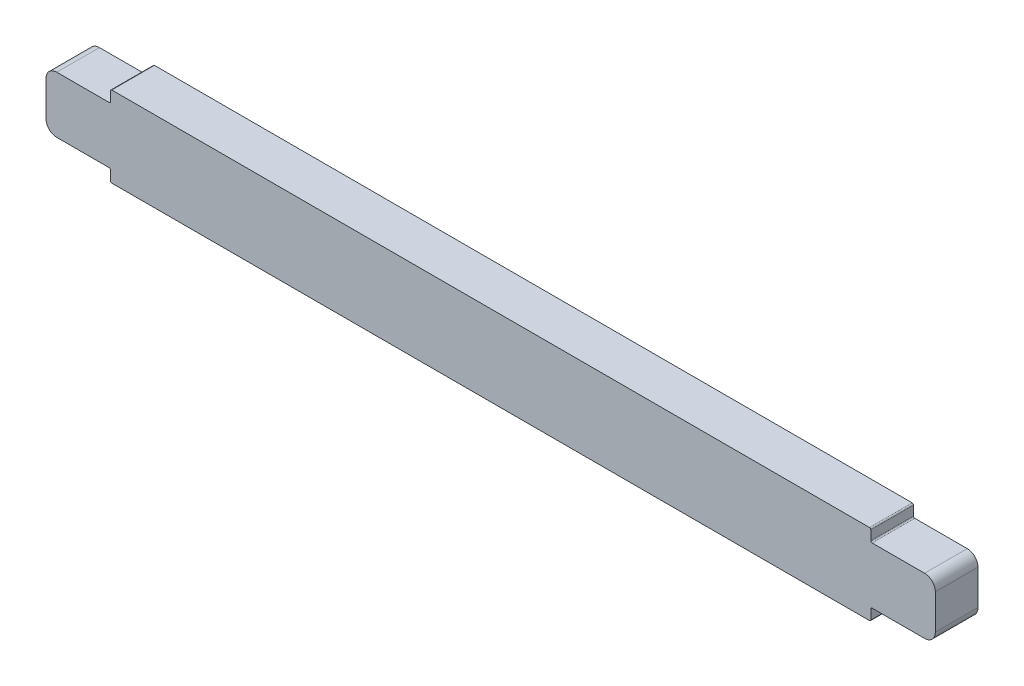
ISO-10303-21;
HEADER;
FILE_DESCRIPTION(('STEP AP214'),'2;1');
FILE_NAME('part.step','',(''),(''),'','','');
FILE_SCHEMA(('AUTOMOTIVE_DESIGN { 1 0 10303 214 1 1 1 1 }'));
ENDSEC;
DATA;
#1=APPLICATION_CONTEXT('core data for automotive mechanical design processes');
#2=APPLICATION_PROTOCOL_DEFINITION('international standard','automotive_design',2000,#1);
#3=PRODUCT_CONTEXT('',#1,'mechanical');
#4=PRODUCT('Part','Part','',(#3));
#5=PRODUCT_RELATED_PRODUCT_CATEGORY('part','',(#4));
#6=PRODUCT_DEFINITION_FORMATION('','',#4);
#7=PRODUCT_DEFINITION_CONTEXT('part definition',#1,'design');
#8=PRODUCT_DEFINITION('design','',#6,#7);
#9=PRODUCT_DEFINITION_SHAPE('','',#8);
#10=(LENGTH_UNIT() NAMED_UNIT(*) SI_UNIT(.MILLI.,.METRE.));
#11=(NAMED_UNIT(*) PLANE_ANGLE_UNIT() SI_UNIT($,.RADIAN.));
#12=(NAMED_UNIT(*) SI_UNIT($,.STERADIAN.) SOLID_ANGLE_UNIT());
#13=UNCERTAINTY_MEASURE_WITH_UNIT(LENGTH_MEASURE(1.E-05),#10,'distance_accuracy_value','');
#14=(GEOMETRIC_REPRESENTATION_CONTEXT(3) GLOBAL_UNCERTAINTY_ASSIGNED_CONTEXT((#13)) GLOBAL_UNIT_ASSIGNED_CONTEXT((#10,
#11,#12)) REPRESENTATION_CONTEXT('',''));
#15=CARTESIAN_POINT('',(0.,0.,0.));
#16=DIRECTION('',(0.,0.,1.));
#17=DIRECTION('',(1.,0.,0.));
#18=AXIS2_PLACEMENT_3D('',#15,#16,#17);
#19=CARTESIAN_POINT('',(33.08,-3.,3.175));
#20=DIRECTION('',(-1.,0.,0.));
#21=DIRECTION('',(0.,0.,1.));
#22=AXIS2_PLACEMENT_3D('',#19,#20,#21);
#23=PLANE('',#22);
#24=DIRECTION('',(0.,1.,0.));
#25=VECTOR('',#24,1.);
#26=CARTESIAN_POINT('',(33.08,-3.,0.));
#27=LINE('',#26,#25);
#28=CARTESIAN_POINT('',(33.08,-1.3,0.));
#29=VERTEX_POINT('',#28);
#30=CARTESIAN_POINT('',(33.08,1.3,0.));
#31=VERTEX_POINT('',#30);
#32=EDGE_CURVE('E362',#29,#31,#27,.T.);
#33=ORIENTED_EDGE('',*,*,#32,.T.);
#34=DIRECTION('',(0.,0.,1.));
#35=VECTOR('',#34,1.);
#36=CARTESIAN_POINT('',(33.08,1.3,3.175));
#37=LINE('',#36,#35);
#38=CARTESIAN_POINT('',(33.08,1.3,3.175));
#39=VERTEX_POINT('',#38);
#40=EDGE_CURVE('E215',#31,#39,#37,.T.);
#41=ORIENTED_EDGE('',*,*,#40,.T.);
#42=DIRECTION('',(0.,1.,0.));
#43=VECTOR('',#42,1.);
#44=CARTESIAN_POINT('',(33.08,-3.,3.175));
#45=LINE('',#44,#43);
#46=CARTESIAN_POINT('',(33.08,-1.3,3.175));
#47=VERTEX_POINT('',#46);
#48=EDGE_CURVE('E199',#47,#39,#45,.T.);
#49=ORIENTED_EDGE('',*,*,#48,.F.);
#50=DIRECTION('',(0.,0.,1.));
#51=VECTOR('',#50,1.);
#52=CARTESIAN_POINT('',(33.08,-1.3,0.));
#53=LINE('',#52,#51);
#54=EDGE_CURVE('E212',#47,#29,#53,.F.);
#55=ORIENTED_EDGE('',*,*,#54,.T.);
#56=EDGE_LOOP('',(#33,#41,#49,#55));
#57=FACE_BOUND('',#56,.T.);
#58=ADVANCED_FACE('F33',(#57),#23,.F.);
#59=CARTESIAN_POINT('',(-33.08,3.,3.175));
#60=DIRECTION('',(0.,-1.,0.));
#61=DIRECTION('',(0.,0.,-1.));
#62=AXIS2_PLACEMENT_3D('',#59,#60,#61);
#63=PLANE('',#62);
#64=DIRECTION('',(-1.,0.,0.));
#65=VECTOR('',#64,1.);
#66=CARTESIAN_POINT('',(-33.08,3.,3.175));
#67=LINE('',#66,#65);
#68=CARTESIAN_POINT('',(28.18,3.,3.175));
#69=VERTEX_POINT('',#68);
#70=CARTESIAN_POINT('',(-28.18,3.,3.175));
#71=VERTEX_POINT('',#70);
#72=EDGE_CURVE('E216',#69,#71,#67,.T.);
#73=ORIENTED_EDGE('',*,*,#72,.F.);
#74=DIRECTION('',(0.,0.,1.));
#75=VECTOR('',#74,1.);
#76=CARTESIAN_POINT('',(28.18,3.,0.));
#77=LINE('',#76,#75);
#78=CARTESIAN_POINT('',(28.18,3.,0.));
#79=VERTEX_POINT('',#78);
#80=EDGE_CURVE('E278',#69,#79,#77,.F.);
#81=ORIENTED_EDGE('',*,*,#80,.T.);
#82=DIRECTION('',(-1.,0.,0.));
#83=VECTOR('',#82,1.);
#84=CARTESIAN_POINT('',(-33.08,3.,0.));
#85=LINE('',#84,#83);
#86=CARTESIAN_POINT('',(-28.18,3.,0.));
#87=VERTEX_POINT('',#86);
#88=EDGE_CURVE('E364',#79,#87,#85,.T.);
#89=ORIENTED_EDGE('',*,*,#88,.T.);
#90=DIRECTION('',(0.,0.,1.));
#91=VECTOR('',#90,1.);
#92=CARTESIAN_POINT('',(-28.18,3.,3.175));
#93=LINE('',#92,#91);
#94=EDGE_CURVE('E275',#87,#71,#93,.T.);
#95=ORIENTED_EDGE('',*,*,#94,.T.);
#96=EDGE_LOOP('',(#73,#81,#89,#95));
#97=FACE_BOUND('',#96,.T.);
#98=ADVANCED_FACE('F411',(#97),#63,.F.);
#99=CARTESIAN_POINT('',(-33.08,-3.,3.175));
#100=DIRECTION('',(0.,1.,0.));
#101=DIRECTION('',(0.,0.,1.));
#102=AXIS2_PLACEMENT_3D('',#99,#100,#101);
#103=PLANE('',#102);
#104=DIRECTION('',(1.,0.,0.));
#105=VECTOR('',#104,1.);
#106=CARTESIAN_POINT('',(-33.08,-3.,3.175));
#107=LINE('',#106,#105);
#108=CARTESIAN_POINT('',(-28.18,-3.,3.175));
#109=VERTEX_POINT('',#108);
#110=CARTESIAN_POINT('',(28.18,-3.,3.175));
#111=VERTEX_POINT('',#110);
#112=EDGE_CURVE('E223',#109,#111,#107,.T.);
#113=ORIENTED_EDGE('',*,*,#112,.F.);
#114=DIRECTION('',(0.,0.,1.));
#115=VECTOR('',#114,1.);
#116=CARTESIAN_POINT('',(-28.18,-3.,3.175));
#117=LINE('',#116,#115);
#118=CARTESIAN_POINT('',(-28.18,-3.,0.));
#119=VERTEX_POINT('',#118);
#120=EDGE_CURVE('E302',#109,#119,#117,.F.);
#121=ORIENTED_EDGE('',*,*,#120,.T.);
#122=DIRECTION('',(1.,0.,0.));
#123=VECTOR('',#122,1.);
#124=CARTESIAN_POINT('',(-33.08,-3.,0.));
#125=LINE('',#124,#123);
#126=CARTESIAN_POINT('',(28.18,-3.,0.));
#127=VERTEX_POINT('',#126);
#128=EDGE_CURVE('E217',#119,#127,#125,.T.);
#129=ORIENTED_EDGE('',*,*,#128,.T.);
#130=DIRECTION('',(0.,0.,1.));
#131=VECTOR('',#130,1.);
#132=CARTESIAN_POINT('',(28.18,-3.,3.175));
#133=LINE('',#132,#131);
#134=EDGE_CURVE('E299',#127,#111,#133,.T.);
#135=ORIENTED_EDGE('',*,*,#134,.T.);
#136=EDGE_LOOP('',(#113,#121,#129,#135));
#137=FACE_BOUND('',#136,.T.);
#138=ADVANCED_FACE('F377',(#137),#103,.F.);
#139=CARTESIAN_POINT('',(0.,0.,3.175));
#140=DIRECTION('',(0.,0.,-1.));
#141=DIRECTION('',(-1.,0.,0.));
#142=AXIS2_PLACEMENT_3D('',#139,#140,#141);
#143=PLANE('',#142);
#144=DIRECTION('',(0.,1.,0.));
#145=VECTOR('',#144,1.);
#146=CARTESIAN_POINT('',(28.28,3.,3.175));
#147=LINE('',#146,#145);
#148=CARTESIAN_POINT('',(28.28,2.2,3.175));
#149=VERTEX_POINT('',#148);
#150=CARTESIAN_POINT('',(28.28,2.9,3.175));
#151=VERTEX_POINT('',#150);
#152=EDGE_CURVE('E429',#149,#151,#147,.T.);
#153=ORIENTED_EDGE('',*,*,#152,.T.);
#154=CARTESIAN_POINT('',(28.18,2.9,3.175));
#155=DIRECTION('',(0.,0.,-1.));
#156=DIRECTION('',(-1.,0.,0.));
#157=AXIS2_PLACEMENT_3D('',#154,#155,#156);
#158=CIRCLE('',#157,0.1);
#159=EDGE_CURVE('E273',#151,#69,#158,.F.);
#160=ORIENTED_EDGE('',*,*,#159,.T.);
#161=ORIENTED_EDGE('',*,*,#72,.T.);
#162=CARTESIAN_POINT('',(-28.18,2.9,3.175));
#163=DIRECTION('',(0.,0.,-1.));
#164=DIRECTION('',(-1.,0.,0.));
#165=AXIS2_PLACEMENT_3D('',#162,#163,#164);
#166=CIRCLE('',#165,0.1);
#167=CARTESIAN_POINT('',(-28.28,2.9,3.175));
#168=VERTEX_POINT('',#167);
#169=EDGE_CURVE('E271',#71,#168,#166,.F.);
#170=ORIENTED_EDGE('',*,*,#169,.T.);
#171=DIRECTION('',(0.,1.,0.));
#172=VECTOR('',#171,1.);
#173=CARTESIAN_POINT('',(-28.28,3.,3.175));
#174=LINE('',#173,#172);
#175=CARTESIAN_POINT('',(-28.28,2.2,3.175));
#176=VERTEX_POINT('',#175);
#177=EDGE_CURVE('E352',#176,#168,#174,.T.);
#178=ORIENTED_EDGE('',*,*,#177,.F.);
#179=CARTESIAN_POINT('',(-28.38,2.2,3.175));
#180=DIRECTION('',(0.,0.,-1.));
#181=DIRECTION('',(-1.,0.,0.));
#182=AXIS2_PLACEMENT_3D('',#179,#180,#181);
#183=CIRCLE('',#182,0.1);
#184=CARTESIAN_POINT('',(-28.38,2.1,3.175));
#185=VERTEX_POINT('',#184);
#186=EDGE_CURVE('E318',#176,#185,#183,.T.);
#187=ORIENTED_EDGE('',*,*,#186,.T.);
#188=DIRECTION('',(1.,0.,0.));
#189=VECTOR('',#188,1.);
#190=CARTESIAN_POINT('',(-33.08,2.1,3.175));
#191=LINE('',#190,#189);
#192=CARTESIAN_POINT('',(-32.28,2.1,3.175));
#193=VERTEX_POINT('',#192);
#194=EDGE_CURVE('E349',#193,#185,#191,.T.);
#195=ORIENTED_EDGE('',*,*,#194,.F.);
#196=CARTESIAN_POINT('',(-32.28,1.3,3.175));
#197=DIRECTION('',(0.,0.,-1.));
#198=DIRECTION('',(-1.,0.,0.));
#199=AXIS2_PLACEMENT_3D('',#196,#197,#198);
#200=CIRCLE('',#199,0.8);
#201=CARTESIAN_POINT('',(-33.08,1.3,3.175));
#202=VERTEX_POINT('',#201);
#203=EDGE_CURVE('E207',#193,#202,#200,.F.);
#204=ORIENTED_EDGE('',*,*,#203,.T.);
#205=DIRECTION('',(0.,-1.,0.));
#206=VECTOR('',#205,1.);
#207=CARTESIAN_POINT('',(-33.08,-3.,3.175));
#208=LINE('',#207,#206);
#209=CARTESIAN_POINT('',(-33.08,-1.3,3.175));
#210=VERTEX_POINT('',#209);
#211=EDGE_CURVE('E228',#202,#210,#208,.T.);
#212=ORIENTED_EDGE('',*,*,#211,.T.);
#213=CARTESIAN_POINT('',(-32.28,-1.3,3.175));
#214=DIRECTION('',(0.,0.,-1.));
#215=DIRECTION('',(-1.,0.,0.));
#216=AXIS2_PLACEMENT_3D('',#213,#214,#215);
#217=CIRCLE('',#216,0.8);
#218=CARTESIAN_POINT('',(-32.28,-2.1,3.175));
#219=VERTEX_POINT('',#218);
#220=EDGE_CURVE('E225',#210,#219,#217,.F.);
#221=ORIENTED_EDGE('',*,*,#220,.T.);
#222=DIRECTION('',(-1.,0.,0.));
#223=VECTOR('',#222,1.);
#224=CARTESIAN_POINT('',(-33.08,-2.1,3.175));
#225=LINE('',#224,#223);
#226=CARTESIAN_POINT('',(-28.38,-2.1,3.175));
#227=VERTEX_POINT('',#226);
#228=EDGE_CURVE('E328',#227,#219,#225,.T.);
#229=ORIENTED_EDGE('',*,*,#228,.F.);
#230=CARTESIAN_POINT('',(-28.38,-2.2,3.175));
#231=DIRECTION('',(0.,0.,-1.));
#232=DIRECTION('',(-1.,0.,0.));
#233=AXIS2_PLACEMENT_3D('',#230,#231,#232);
#234=CIRCLE('',#233,0.1);
#235=CARTESIAN_POINT('',(-28.28,-2.2,3.175));
#236=VERTEX_POINT('',#235);
#237=EDGE_CURVE('E41',#227,#236,#234,.T.);
#238=ORIENTED_EDGE('',*,*,#237,.T.);
#239=DIRECTION('',(0.,1.,0.));
#240=VECTOR('',#239,1.);
#241=CARTESIAN_POINT('',(-28.28,-3.,3.175));
#242=LINE('',#241,#240);
#243=CARTESIAN_POINT('',(-28.28,-2.9,3.175));
#244=VERTEX_POINT('',#243);
#245=EDGE_CURVE('E327',#244,#236,#242,.T.);
#246=ORIENTED_EDGE('',*,*,#245,.F.);
#247=CARTESIAN_POINT('',(-28.18,-2.9,3.175));
#248=DIRECTION('',(0.,0.,-1.));
#249=DIRECTION('',(-1.,0.,0.));
#250=AXIS2_PLACEMENT_3D('',#247,#248,#249);
#251=CIRCLE('',#250,0.1);
#252=EDGE_CURVE('E269',#244,#109,#251,.F.);
#253=ORIENTED_EDGE('',*,*,#252,.T.);
#254=ORIENTED_EDGE('',*,*,#112,.T.);
#255=CARTESIAN_POINT('',(28.18,-2.9,3.175));
#256=DIRECTION('',(0.,0.,-1.));
#257=DIRECTION('',(-1.,0.,0.));
#258=AXIS2_PLACEMENT_3D('',#255,#256,#257);
#259=CIRCLE('',#258,0.1);
#260=CARTESIAN_POINT('',(28.28,-2.9,3.175));
#261=VERTEX_POINT('',#260);
#262=EDGE_CURVE('E267',#111,#261,#259,.F.);
#263=ORIENTED_EDGE('',*,*,#262,.T.);
#264=DIRECTION('',(0.,1.,0.));
#265=VECTOR('',#264,1.);
#266=CARTESIAN_POINT('',(28.28,-3.,3.175));
#267=LINE('',#266,#265);
#268=CARTESIAN_POINT('',(28.28,-2.2,3.175));
#269=VERTEX_POINT('',#268);
#270=EDGE_CURVE('E386',#261,#269,#267,.T.);
#271=ORIENTED_EDGE('',*,*,#270,.T.);
#272=CARTESIAN_POINT('',(28.38,-2.2,3.175));
#273=DIRECTION('',(0.,0.,-1.));
#274=DIRECTION('',(-1.,0.,0.));
#275=AXIS2_PLACEMENT_3D('',#272,#273,#274);
#276=CIRCLE('',#275,0.1);
#277=CARTESIAN_POINT('',(28.38,-2.1,3.175));
#278=VERTEX_POINT('',#277);
#279=EDGE_CURVE('E321',#269,#278,#276,.T.);
#280=ORIENTED_EDGE('',*,*,#279,.T.);
#281=DIRECTION('',(1.,0.,0.));
#282=VECTOR('',#281,1.);
#283=CARTESIAN_POINT('',(33.08,-2.1,3.175));
#284=LINE('',#283,#282);
#285=CARTESIAN_POINT('',(32.28,-2.1,3.175));
#286=VERTEX_POINT('',#285);
#287=EDGE_CURVE('E201',#278,#286,#284,.T.);
#288=ORIENTED_EDGE('',*,*,#287,.T.);
#289=CARTESIAN_POINT('',(32.28,-1.3,3.175));
#290=DIRECTION('',(0.,0.,-1.));
#291=DIRECTION('',(-1.,0.,0.));
#292=AXIS2_PLACEMENT_3D('',#289,#290,#291);
#293=CIRCLE('',#292,0.8);
#294=EDGE_CURVE('E195',#286,#47,#293,.F.);
#295=ORIENTED_EDGE('',*,*,#294,.T.);
#296=ORIENTED_EDGE('',*,*,#48,.T.);
#297=CARTESIAN_POINT('',(32.28,1.3,3.175));
#298=DIRECTION('',(0.,0.,-1.));
#299=DIRECTION('',(-1.,0.,0.));
#300=AXIS2_PLACEMENT_3D('',#297,#298,#299);
#301=CIRCLE('',#300,0.8);
#302=CARTESIAN_POINT('',(32.28,2.1,3.175));
#303=VERTEX_POINT('',#302);
#304=EDGE_CURVE('E206',#39,#303,#301,.F.);
#305=ORIENTED_EDGE('',*,*,#304,.T.);
#306=DIRECTION('',(-1.,0.,0.));
#307=VECTOR('',#306,1.);
#308=CARTESIAN_POINT('',(33.08,2.1,3.175));
#309=LINE('',#308,#307);
#310=CARTESIAN_POINT('',(28.38,2.1,3.175));
#311=VERTEX_POINT('',#310);
#312=EDGE_CURVE('E424',#303,#311,#309,.T.);
#313=ORIENTED_EDGE('',*,*,#312,.T.);
#314=CARTESIAN_POINT('',(28.38,2.2,3.175));
#315=DIRECTION('',(0.,0.,-1.));
#316=DIRECTION('',(-1.,0.,0.));
#317=AXIS2_PLACEMENT_3D('',#314,#315,#316);
#318=CIRCLE('',#317,0.1);
#319=EDGE_CURVE('E314',#311,#149,#318,.T.);
#320=ORIENTED_EDGE('',*,*,#319,.T.);
#321=EDGE_LOOP('',(#153,#160,#161,#170,#178,#187,#195,#204,#212,#221,#229,#238,#246,#253,#254,
#263,#271,#280,#288,#295,#296,#305,#313,#320));
#322=FACE_BOUND('',#321,.T.);
#323=ADVANCED_FACE('F198',(#322),#143,.F.);
#324=CARTESIAN_POINT('',(0.,0.,0.));
#325=DIRECTION('',(0.,0.,-1.));
#326=DIRECTION('',(-1.,0.,0.));
#327=AXIS2_PLACEMENT_3D('',#324,#325,#326);
#328=PLANE('',#327);
#329=ORIENTED_EDGE('',*,*,#88,.F.);
#330=CARTESIAN_POINT('',(28.18,2.9,0.));
#331=DIRECTION('',(0.,0.,-1.));
#332=DIRECTION('',(-1.,0.,0.));
#333=AXIS2_PLACEMENT_3D('',#330,#331,#332);
#334=CIRCLE('',#333,0.1);
#335=CARTESIAN_POINT('',(28.28,2.9,0.));
#336=VERTEX_POINT('',#335);
#337=EDGE_CURVE('E286',#79,#336,#334,.T.);
#338=ORIENTED_EDGE('',*,*,#337,.T.);
#339=DIRECTION('',(0.,1.,0.));
#340=VECTOR('',#339,1.);
#341=CARTESIAN_POINT('',(28.28,3.,0.));
#342=LINE('',#341,#340);
#343=CARTESIAN_POINT('',(28.28,2.2,0.));
#344=VERTEX_POINT('',#343);
#345=EDGE_CURVE('E418',#344,#336,#342,.T.);
#346=ORIENTED_EDGE('',*,*,#345,.F.);
#347=CARTESIAN_POINT('',(28.38,2.2,0.));
#348=DIRECTION('',(0.,0.,-1.));
#349=DIRECTION('',(-1.,0.,0.));
#350=AXIS2_PLACEMENT_3D('',#347,#348,#349);
#351=CIRCLE('',#350,0.1);
#352=CARTESIAN_POINT('',(28.38,2.1,0.));
#353=VERTEX_POINT('',#352);
#354=EDGE_CURVE('E316',#344,#353,#351,.F.);
#355=ORIENTED_EDGE('',*,*,#354,.T.);
#356=DIRECTION('',(-1.,0.,0.));
#357=VECTOR('',#356,1.);
#358=CARTESIAN_POINT('',(33.08,2.1,0.));
#359=LINE('',#358,#357);
#360=CARTESIAN_POINT('',(32.28,2.1,0.));
#361=VERTEX_POINT('',#360);
#362=EDGE_CURVE('E337',#361,#353,#359,.T.);
#363=ORIENTED_EDGE('',*,*,#362,.F.);
#364=CARTESIAN_POINT('',(32.28,1.3,0.));
#365=DIRECTION('',(0.,0.,-1.));
#366=DIRECTION('',(-1.,0.,0.));
#367=AXIS2_PLACEMENT_3D('',#364,#365,#366);
#368=CIRCLE('',#367,0.8);
#369=EDGE_CURVE('E244',#361,#31,#368,.T.);
#370=ORIENTED_EDGE('',*,*,#369,.T.);
#371=ORIENTED_EDGE('',*,*,#32,.F.);
#372=CARTESIAN_POINT('',(32.28,-1.3,0.));
#373=DIRECTION('',(0.,0.,-1.));
#374=DIRECTION('',(-1.,0.,0.));
#375=AXIS2_PLACEMENT_3D('',#372,#373,#374);
#376=CIRCLE('',#375,0.8);
#377=CARTESIAN_POINT('',(32.28,-2.1,0.));
#378=VERTEX_POINT('',#377);
#379=EDGE_CURVE('E222',#29,#378,#376,.T.);
#380=ORIENTED_EDGE('',*,*,#379,.T.);
#381=DIRECTION('',(1.,0.,0.));
#382=VECTOR('',#381,1.);
#383=CARTESIAN_POINT('',(33.08,-2.1,0.));
#384=LINE('',#383,#382);
#385=CARTESIAN_POINT('',(28.38,-2.1,0.));
#386=VERTEX_POINT('',#385);
#387=EDGE_CURVE('E392',#386,#378,#384,.T.);
#388=ORIENTED_EDGE('',*,*,#387,.F.);
#389=CARTESIAN_POINT('',(28.38,-2.2,0.));
#390=DIRECTION('',(0.,0.,-1.));
#391=DIRECTION('',(-1.,0.,0.));
#392=AXIS2_PLACEMENT_3D('',#389,#390,#391);
#393=CIRCLE('',#392,0.1);
#394=CARTESIAN_POINT('',(28.28,-2.2,0.));
#395=VERTEX_POINT('',#394);
#396=EDGE_CURVE('E323',#386,#395,#393,.F.);
#397=ORIENTED_EDGE('',*,*,#396,.T.);
#398=DIRECTION('',(0.,1.,0.));
#399=VECTOR('',#398,1.);
#400=CARTESIAN_POINT('',(28.28,-3.,0.));
#401=LINE('',#400,#399);
#402=CARTESIAN_POINT('',(28.28,-2.9,0.));
#403=VERTEX_POINT('',#402);
#404=EDGE_CURVE('E394',#403,#395,#401,.T.);
#405=ORIENTED_EDGE('',*,*,#404,.F.);
#406=CARTESIAN_POINT('',(28.18,-2.9,0.));
#407=DIRECTION('',(0.,0.,-1.));
#408=DIRECTION('',(-1.,0.,0.));
#409=AXIS2_PLACEMENT_3D('',#406,#407,#408);
#410=CIRCLE('',#409,0.1);
#411=EDGE_CURVE('E280',#403,#127,#410,.T.);
#412=ORIENTED_EDGE('',*,*,#411,.T.);
#413=ORIENTED_EDGE('',*,*,#128,.F.);
#414=CARTESIAN_POINT('',(-28.18,-2.9,0.));
#415=DIRECTION('',(0.,0.,-1.));
#416=DIRECTION('',(-1.,0.,0.));
#417=AXIS2_PLACEMENT_3D('',#414,#415,#416);
#418=CIRCLE('',#417,0.1);
#419=CARTESIAN_POINT('',(-28.28,-2.9,0.));
#420=VERTEX_POINT('',#419);
#421=EDGE_CURVE('E282',#119,#420,#418,.T.);
#422=ORIENTED_EDGE('',*,*,#421,.T.);
#423=DIRECTION('',(0.,1.,0.));
#424=VECTOR('',#423,1.);
#425=CARTESIAN_POINT('',(-28.28,-3.,0.));
#426=LINE('',#425,#424);
#427=CARTESIAN_POINT('',(-28.28,-2.2,0.));
#428=VERTEX_POINT('',#427);
#429=EDGE_CURVE('E344',#420,#428,#426,.T.);
#430=ORIENTED_EDGE('',*,*,#429,.T.);
#431=CARTESIAN_POINT('',(-28.38,-2.2,0.));
#432=DIRECTION('',(0.,0.,-1.));
#433=DIRECTION('',(-1.,0.,0.));
#434=AXIS2_PLACEMENT_3D('',#431,#432,#433);
#435=CIRCLE('',#434,0.1);
#436=CARTESIAN_POINT('',(-28.38,-2.1,0.));
#437=VERTEX_POINT('',#436);
#438=EDGE_CURVE('E11',#428,#437,#435,.F.);
#439=ORIENTED_EDGE('',*,*,#438,.T.);
#440=DIRECTION('',(-1.,0.,0.));
#441=VECTOR('',#440,1.);
#442=CARTESIAN_POINT('',(-33.08,-2.1,0.));
#443=LINE('',#442,#441);
#444=CARTESIAN_POINT('',(-32.28,-2.1,0.));
#445=VERTEX_POINT('',#444);
#446=EDGE_CURVE('E343',#437,#445,#443,.T.);
#447=ORIENTED_EDGE('',*,*,#446,.T.);
#448=CARTESIAN_POINT('',(-32.28,-1.3,0.));
#449=DIRECTION('',(0.,0.,-1.));
#450=DIRECTION('',(-1.,0.,0.));
#451=AXIS2_PLACEMENT_3D('',#448,#449,#450);
#452=CIRCLE('',#451,0.8);
#453=CARTESIAN_POINT('',(-33.08,-1.3,0.));
#454=VERTEX_POINT('',#453);
#455=EDGE_CURVE('E239',#445,#454,#452,.T.);
#456=ORIENTED_EDGE('',*,*,#455,.T.);
#457=DIRECTION('',(0.,-1.,0.));
#458=VECTOR('',#457,1.);
#459=CARTESIAN_POINT('',(-33.08,-3.,0.));
#460=LINE('',#459,#458);
#461=CARTESIAN_POINT('',(-33.08,1.3,0.));
#462=VERTEX_POINT('',#461);
#463=EDGE_CURVE('E367',#462,#454,#460,.T.);
#464=ORIENTED_EDGE('',*,*,#463,.F.);
#465=CARTESIAN_POINT('',(-32.28,1.3,0.));
#466=DIRECTION('',(0.,0.,-1.));
#467=DIRECTION('',(-1.,0.,0.));
#468=AXIS2_PLACEMENT_3D('',#465,#466,#467);
#469=CIRCLE('',#468,0.8);
#470=CARTESIAN_POINT('',(-32.28,2.1,0.));
#471=VERTEX_POINT('',#470);
#472=EDGE_CURVE('E241',#462,#471,#469,.T.);
#473=ORIENTED_EDGE('',*,*,#472,.T.);
#474=DIRECTION('',(1.,0.,0.));
#475=VECTOR('',#474,1.);
#476=CARTESIAN_POINT('',(-33.08,2.1,0.));
#477=LINE('',#476,#475);
#478=CARTESIAN_POINT('',(-28.38,2.1,0.));
#479=VERTEX_POINT('',#478);
#480=EDGE_CURVE('E399',#471,#479,#477,.T.);
#481=ORIENTED_EDGE('',*,*,#480,.T.);
#482=CARTESIAN_POINT('',(-28.38,2.2,0.));
#483=DIRECTION('',(0.,0.,-1.));
#484=DIRECTION('',(-1.,0.,0.));
#485=AXIS2_PLACEMENT_3D('',#482,#483,#484);
#486=CIRCLE('',#485,0.1);
#487=CARTESIAN_POINT('',(-28.28,2.2,0.));
#488=VERTEX_POINT('',#487);
#489=EDGE_CURVE('E55',#479,#488,#486,.F.);
#490=ORIENTED_EDGE('',*,*,#489,.T.);
#491=DIRECTION('',(0.,1.,0.));
#492=VECTOR('',#491,1.);
#493=CARTESIAN_POINT('',(-28.28,3.,0.));
#494=LINE('',#493,#492);
#495=CARTESIAN_POINT('',(-28.28,2.9,0.));
#496=VERTEX_POINT('',#495);
#497=EDGE_CURVE('E365',#488,#496,#494,.T.);
#498=ORIENTED_EDGE('',*,*,#497,.T.);
#499=CARTESIAN_POINT('',(-28.18,2.9,0.));
#500=DIRECTION('',(0.,0.,-1.));
#501=DIRECTION('',(-1.,0.,0.));
#502=AXIS2_PLACEMENT_3D('',#499,#500,#501);
#503=CIRCLE('',#502,0.1);
#504=EDGE_CURVE('E284',#496,#87,#503,.T.);
#505=ORIENTED_EDGE('',*,*,#504,.T.);
#506=EDGE_LOOP('',(#329,#338,#346,#355,#363,#370,#371,#380,#388,#397,#405,#412,#413,#422,#430,
#439,#447,#456,#464,#473,#481,#490,#498,#505));
#507=FACE_BOUND('',#506,.T.);
#508=ADVANCED_FACE('F342',(#507),#328,.T.);
#509=CARTESIAN_POINT('',(-33.08,-3.,3.175));
#510=DIRECTION('',(1.,0.,0.));
#511=DIRECTION('',(0.,0.,-1.));
#512=AXIS2_PLACEMENT_3D('',#509,#510,#511);
#513=PLANE('',#512);
#514=ORIENTED_EDGE('',*,*,#211,.F.);
#515=DIRECTION('',(0.,0.,1.));
#516=VECTOR('',#515,1.);
#517=CARTESIAN_POINT('',(-33.08,1.3,3.175));
#518=LINE('',#517,#516);
#519=EDGE_CURVE('E254',#202,#462,#518,.F.);
#520=ORIENTED_EDGE('',*,*,#519,.T.);
#521=ORIENTED_EDGE('',*,*,#463,.T.);
#522=DIRECTION('',(0.,0.,1.));
#523=VECTOR('',#522,1.);
#524=CARTESIAN_POINT('',(-33.08,-1.3,3.175));
#525=LINE('',#524,#523);
#526=EDGE_CURVE('E251',#454,#210,#525,.T.);
#527=ORIENTED_EDGE('',*,*,#526,.T.);
#528=EDGE_LOOP('',(#514,#520,#521,#527));
#529=FACE_BOUND('',#528,.T.);
#530=ADVANCED_FACE('F489',(#529),#513,.F.);
#531=CARTESIAN_POINT('',(-33.08,-2.1,0.));
#532=DIRECTION('',(0.,1.,0.));
#533=DIRECTION('',(0.,0.,1.));
#534=AXIS2_PLACEMENT_3D('',#531,#532,#533);
#535=PLANE('',#534);
#536=ORIENTED_EDGE('',*,*,#446,.F.);
#537=DIRECTION('',(0.,0.,1.));
#538=VECTOR('',#537,1.);
#539=CARTESIAN_POINT('',(-28.38,-2.1,3.175));
#540=LINE('',#539,#538);
#541=EDGE_CURVE('E311',#437,#227,#540,.T.);
#542=ORIENTED_EDGE('',*,*,#541,.T.);
#543=ORIENTED_EDGE('',*,*,#228,.T.);
#544=DIRECTION('',(0.,0.,1.));
#545=VECTOR('',#544,1.);
#546=CARTESIAN_POINT('',(-32.28,-2.1,0.));
#547=LINE('',#546,#545);
#548=EDGE_CURVE('E256',#219,#445,#547,.F.);
#549=ORIENTED_EDGE('',*,*,#548,.T.);
#550=EDGE_LOOP('',(#536,#542,#543,#549));
#551=FACE_BOUND('',#550,.T.);
#552=ADVANCED_FACE('F346',(#551),#535,.F.);
#553=CARTESIAN_POINT('',(-28.28,-3.,0.));
#554=DIRECTION('',(1.,0.,0.));
#555=DIRECTION('',(0.,0.,-1.));
#556=AXIS2_PLACEMENT_3D('',#553,#554,#555);
#557=PLANE('',#556);
#558=ORIENTED_EDGE('',*,*,#429,.F.);
#559=DIRECTION('',(0.,0.,1.));
#560=VECTOR('',#559,1.);
#561=CARTESIAN_POINT('',(-28.28,-2.9,0.));
#562=LINE('',#561,#560);
#563=EDGE_CURVE('E296',#420,#244,#562,.T.);
#564=ORIENTED_EDGE('',*,*,#563,.T.);
#565=ORIENTED_EDGE('',*,*,#245,.T.);
#566=DIRECTION('',(0.,0.,1.));
#567=VECTOR('',#566,1.);
#568=CARTESIAN_POINT('',(-28.28,-2.2,0.));
#569=LINE('',#568,#567);
#570=EDGE_CURVE('E294',#236,#428,#569,.F.);
#571=ORIENTED_EDGE('',*,*,#570,.T.);
#572=EDGE_LOOP('',(#558,#564,#565,#571));
#573=FACE_BOUND('',#572,.T.);
#574=ADVANCED_FACE('F334',(#573),#557,.F.);
#575=CARTESIAN_POINT('',(-28.28,3.,0.));
#576=DIRECTION('',(1.,0.,0.));
#577=DIRECTION('',(0.,0.,-1.));
#578=AXIS2_PLACEMENT_3D('',#575,#576,#577);
#579=PLANE('',#578);
#580=ORIENTED_EDGE('',*,*,#177,.T.);
#581=DIRECTION('',(0.,0.,1.));
#582=VECTOR('',#581,1.);
#583=CARTESIAN_POINT('',(-28.28,2.9,0.));
#584=LINE('',#583,#582);
#585=EDGE_CURVE('E48',#168,#496,#584,.F.);
#586=ORIENTED_EDGE('',*,*,#585,.T.);
#587=ORIENTED_EDGE('',*,*,#497,.F.);
#588=DIRECTION('',(0.,0.,1.));
#589=VECTOR('',#588,1.);
#590=CARTESIAN_POINT('',(-28.28,2.2,3.175));
#591=LINE('',#590,#589);
#592=EDGE_CURVE('E288',#488,#176,#591,.T.);
#593=ORIENTED_EDGE('',*,*,#592,.T.);
#594=EDGE_LOOP('',(#580,#586,#587,#593));
#595=FACE_BOUND('',#594,.T.);
#596=ADVANCED_FACE('F402',(#595),#579,.F.);
#597=CARTESIAN_POINT('',(-33.08,2.1,0.));
#598=DIRECTION('',(0.,-1.,0.));
#599=DIRECTION('',(0.,0.,-1.));
#600=AXIS2_PLACEMENT_3D('',#597,#598,#599);
#601=PLANE('',#600);
#602=ORIENTED_EDGE('',*,*,#194,.T.);
#603=DIRECTION('',(0.,0.,1.));
#604=VECTOR('',#603,1.);
#605=CARTESIAN_POINT('',(-28.38,2.1,0.));
#606=LINE('',#605,#604);
#607=EDGE_CURVE('E292',#185,#479,#606,.F.);
#608=ORIENTED_EDGE('',*,*,#607,.T.);
#609=ORIENTED_EDGE('',*,*,#480,.F.);
#610=DIRECTION('',(0.,0.,1.));
#611=VECTOR('',#610,1.);
#612=CARTESIAN_POINT('',(-32.28,2.1,0.));
#613=LINE('',#612,#611);
#614=EDGE_CURVE('E248',#471,#193,#613,.T.);
#615=ORIENTED_EDGE('',*,*,#614,.T.);
#616=EDGE_LOOP('',(#602,#608,#609,#615));
#617=FACE_BOUND('',#616,.T.);
#618=ADVANCED_FACE('F483',(#617),#601,.F.);
#619=CARTESIAN_POINT('',(28.28,-3.,0.));
#620=DIRECTION('',(1.,0.,0.));
#621=DIRECTION('',(0.,0.,-1.));
#622=AXIS2_PLACEMENT_3D('',#619,#620,#621);
#623=PLANE('',#622);
#624=ORIENTED_EDGE('',*,*,#270,.F.);
#625=DIRECTION('',(0.,0.,1.));
#626=VECTOR('',#625,1.);
#627=CARTESIAN_POINT('',(28.28,-2.9,0.));
#628=LINE('',#627,#626);
#629=EDGE_CURVE('E307',#261,#403,#628,.F.);
#630=ORIENTED_EDGE('',*,*,#629,.T.);
#631=ORIENTED_EDGE('',*,*,#404,.T.);
#632=DIRECTION('',(0.,0.,1.));
#633=VECTOR('',#632,1.);
#634=CARTESIAN_POINT('',(28.28,-2.2,3.175));
#635=LINE('',#634,#633);
#636=EDGE_CURVE('E304',#395,#269,#635,.T.);
#637=ORIENTED_EDGE('',*,*,#636,.T.);
#638=EDGE_LOOP('',(#624,#630,#631,#637));
#639=FACE_BOUND('',#638,.T.);
#640=ADVANCED_FACE('F388',(#639),#623,.T.);
#641=CARTESIAN_POINT('',(33.08,-2.1,0.));
#642=DIRECTION('',(0.,-1.,0.));
#643=DIRECTION('',(0.,0.,-1.));
#644=AXIS2_PLACEMENT_3D('',#641,#642,#643);
#645=PLANE('',#644);
#646=ORIENTED_EDGE('',*,*,#287,.F.);
#647=DIRECTION('',(0.,0.,1.));
#648=VECTOR('',#647,1.);
#649=CARTESIAN_POINT('',(28.38,-2.1,0.));
#650=LINE('',#649,#648);
#651=EDGE_CURVE('E309',#278,#386,#650,.F.);
#652=ORIENTED_EDGE('',*,*,#651,.T.);
#653=ORIENTED_EDGE('',*,*,#387,.T.);
#654=DIRECTION('',(0.,0.,1.));
#655=VECTOR('',#654,1.);
#656=CARTESIAN_POINT('',(32.28,-2.1,3.175));
#657=LINE('',#656,#655);
#658=EDGE_CURVE('E246',#378,#286,#657,.T.);
#659=ORIENTED_EDGE('',*,*,#658,.T.);
#660=EDGE_LOOP('',(#646,#652,#653,#659));
#661=FACE_BOUND('',#660,.T.);
#662=ADVANCED_FACE('F437',(#661),#645,.T.);
#663=CARTESIAN_POINT('',(33.08,2.1,0.));
#664=DIRECTION('',(0.,1.,0.));
#665=DIRECTION('',(0.,0.,1.));
#666=AXIS2_PLACEMENT_3D('',#663,#664,#665);
#667=PLANE('',#666);
#668=ORIENTED_EDGE('',*,*,#362,.T.);
#669=DIRECTION('',(0.,0.,1.));
#670=VECTOR('',#669,1.);
#671=CARTESIAN_POINT('',(28.38,2.1,3.175));
#672=LINE('',#671,#670);
#673=EDGE_CURVE('E259',#353,#311,#672,.T.);
#674=ORIENTED_EDGE('',*,*,#673,.T.);
#675=ORIENTED_EDGE('',*,*,#312,.F.);
#676=DIRECTION('',(0.,0.,1.));
#677=VECTOR('',#676,1.);
#678=CARTESIAN_POINT('',(32.28,2.1,0.));
#679=LINE('',#678,#677);
#680=EDGE_CURVE('E237',#303,#361,#679,.F.);
#681=ORIENTED_EDGE('',*,*,#680,.T.);
#682=EDGE_LOOP('',(#668,#674,#675,#681));
#683=FACE_BOUND('',#682,.T.);
#684=ADVANCED_FACE('F446',(#683),#667,.T.);
#685=CARTESIAN_POINT('',(28.28,3.,0.));
#686=DIRECTION('',(1.,0.,0.));
#687=DIRECTION('',(0.,0.,-1.));
#688=AXIS2_PLACEMENT_3D('',#685,#686,#687);
#689=PLANE('',#688);
#690=ORIENTED_EDGE('',*,*,#152,.F.);
#691=DIRECTION('',(0.,0.,1.));
#692=VECTOR('',#691,1.);
#693=CARTESIAN_POINT('',(28.28,2.2,0.));
#694=LINE('',#693,#692);
#695=EDGE_CURVE('E265',#149,#344,#694,.F.);
#696=ORIENTED_EDGE('',*,*,#695,.T.);
#697=ORIENTED_EDGE('',*,*,#345,.T.);
#698=DIRECTION('',(0.,0.,1.));
#699=VECTOR('',#698,1.);
#700=CARTESIAN_POINT('',(28.28,2.9,3.175));
#701=LINE('',#700,#699);
#702=EDGE_CURVE('E262',#336,#151,#701,.T.);
#703=ORIENTED_EDGE('',*,*,#702,.T.);
#704=EDGE_LOOP('',(#690,#696,#697,#703));
#705=FACE_BOUND('',#704,.T.);
#706=ADVANCED_FACE('F422',(#705),#689,.T.);
#707=CARTESIAN_POINT('',(32.28,1.3,3.175));
#708=DIRECTION('',(0.,0.,-1.));
#709=DIRECTION('',(-1.,0.,0.));
#710=AXIS2_PLACEMENT_3D('',#707,#708,#709);
#711=CYLINDRICAL_SURFACE('',#710,0.8);
#712=ORIENTED_EDGE('',*,*,#369,.F.);
#713=ORIENTED_EDGE('',*,*,#680,.F.);
#714=ORIENTED_EDGE('',*,*,#304,.F.);
#715=ORIENTED_EDGE('',*,*,#40,.F.);
#716=EDGE_LOOP('',(#712,#713,#714,#715));
#717=FACE_BOUND('',#716,.T.);
#718=ADVANCED_FACE('F442',(#717),#711,.T.);
#719=CARTESIAN_POINT('',(32.28,-1.3,0.));
#720=DIRECTION('',(0.,0.,-1.));
#721=DIRECTION('',(-1.,0.,0.));
#722=AXIS2_PLACEMENT_3D('',#719,#720,#721);
#723=CYLINDRICAL_SURFACE('',#722,0.8);
#724=ORIENTED_EDGE('',*,*,#379,.F.);
#725=ORIENTED_EDGE('',*,*,#54,.F.);
#726=ORIENTED_EDGE('',*,*,#294,.F.);
#727=ORIENTED_EDGE('',*,*,#658,.F.);
#728=EDGE_LOOP('',(#724,#725,#726,#727));
#729=FACE_BOUND('',#728,.T.);
#730=ADVANCED_FACE('F220',(#729),#723,.T.);
#731=CARTESIAN_POINT('',(-32.28,1.3,0.));
#732=DIRECTION('',(0.,0.,1.));
#733=DIRECTION('',(1.,0.,0.));
#734=AXIS2_PLACEMENT_3D('',#731,#732,#733);
#735=CYLINDRICAL_SURFACE('',#734,0.8);
#736=ORIENTED_EDGE('',*,*,#472,.F.);
#737=ORIENTED_EDGE('',*,*,#519,.F.);
#738=ORIENTED_EDGE('',*,*,#203,.F.);
#739=ORIENTED_EDGE('',*,*,#614,.F.);
#740=EDGE_LOOP('',(#736,#737,#738,#739));
#741=FACE_BOUND('',#740,.T.);
#742=ADVANCED_FACE('F458',(#741),#735,.T.);
#743=CARTESIAN_POINT('',(-32.28,-1.3,3.175));
#744=DIRECTION('',(0.,0.,1.));
#745=DIRECTION('',(1.,0.,0.));
#746=AXIS2_PLACEMENT_3D('',#743,#744,#745);
#747=CYLINDRICAL_SURFACE('',#746,0.8);
#748=ORIENTED_EDGE('',*,*,#455,.F.);
#749=ORIENTED_EDGE('',*,*,#548,.F.);
#750=ORIENTED_EDGE('',*,*,#220,.F.);
#751=ORIENTED_EDGE('',*,*,#526,.F.);
#752=EDGE_LOOP('',(#748,#749,#750,#751));
#753=FACE_BOUND('',#752,.T.);
#754=ADVANCED_FACE('F451',(#753),#747,.T.);
#755=CARTESIAN_POINT('',(28.38,2.2,0.));
#756=DIRECTION('',(0.,0.,-1.));
#757=DIRECTION('',(-1.,0.,0.));
#758=AXIS2_PLACEMENT_3D('',#755,#756,#757);
#759=CYLINDRICAL_SURFACE('',#758,0.1);
#760=ORIENTED_EDGE('',*,*,#354,.F.);
#761=ORIENTED_EDGE('',*,*,#695,.F.);
#762=ORIENTED_EDGE('',*,*,#319,.F.);
#763=ORIENTED_EDGE('',*,*,#673,.F.);
#764=EDGE_LOOP('',(#760,#761,#762,#763));
#765=FACE_BOUND('',#764,.T.);
#766=ADVANCED_FACE('F449',(#765),#759,.F.);
#767=CARTESIAN_POINT('',(28.18,2.9,0.));
#768=DIRECTION('',(0.,0.,-1.));
#769=DIRECTION('',(-1.,0.,0.));
#770=AXIS2_PLACEMENT_3D('',#767,#768,#769);
#771=CYLINDRICAL_SURFACE('',#770,0.1);
#772=ORIENTED_EDGE('',*,*,#337,.F.);
#773=ORIENTED_EDGE('',*,*,#80,.F.);
#774=ORIENTED_EDGE('',*,*,#159,.F.);
#775=ORIENTED_EDGE('',*,*,#702,.F.);
#776=EDGE_LOOP('',(#772,#773,#774,#775));
#777=FACE_BOUND('',#776,.T.);
#778=ADVANCED_FACE('F414',(#777),#771,.T.);
#779=CARTESIAN_POINT('',(-28.18,2.9,3.175));
#780=DIRECTION('',(0.,0.,1.));
#781=DIRECTION('',(1.,0.,0.));
#782=AXIS2_PLACEMENT_3D('',#779,#780,#781);
#783=CYLINDRICAL_SURFACE('',#782,0.1);
#784=ORIENTED_EDGE('',*,*,#504,.F.);
#785=ORIENTED_EDGE('',*,*,#585,.F.);
#786=ORIENTED_EDGE('',*,*,#169,.F.);
#787=ORIENTED_EDGE('',*,*,#94,.F.);
#788=EDGE_LOOP('',(#784,#785,#786,#787));
#789=FACE_BOUND('',#788,.T.);
#790=ADVANCED_FACE('F406',(#789),#783,.T.);
#791=CARTESIAN_POINT('',(-28.38,2.2,0.));
#792=DIRECTION('',(0.,0.,-1.));
#793=DIRECTION('',(-1.,0.,0.));
#794=AXIS2_PLACEMENT_3D('',#791,#792,#793);
#795=CYLINDRICAL_SURFACE('',#794,0.1);
#796=ORIENTED_EDGE('',*,*,#489,.F.);
#797=ORIENTED_EDGE('',*,*,#607,.F.);
#798=ORIENTED_EDGE('',*,*,#186,.F.);
#799=ORIENTED_EDGE('',*,*,#592,.F.);
#800=EDGE_LOOP('',(#796,#797,#798,#799));
#801=FACE_BOUND('',#800,.T.);
#802=ADVANCED_FACE('F487',(#801),#795,.F.);
#803=CARTESIAN_POINT('',(-28.18,-2.9,0.));
#804=DIRECTION('',(0.,0.,1.));
#805=DIRECTION('',(1.,0.,0.));
#806=AXIS2_PLACEMENT_3D('',#803,#804,#805);
#807=CYLINDRICAL_SURFACE('',#806,0.1);
#808=ORIENTED_EDGE('',*,*,#421,.F.);
#809=ORIENTED_EDGE('',*,*,#120,.F.);
#810=ORIENTED_EDGE('',*,*,#252,.F.);
#811=ORIENTED_EDGE('',*,*,#563,.F.);
#812=EDGE_LOOP('',(#808,#809,#810,#811));
#813=FACE_BOUND('',#812,.T.);
#814=ADVANCED_FACE('F549',(#813),#807,.T.);
#815=CARTESIAN_POINT('',(28.18,-2.9,3.175));
#816=DIRECTION('',(0.,0.,-1.));
#817=DIRECTION('',(-1.,0.,0.));
#818=AXIS2_PLACEMENT_3D('',#815,#816,#817);
#819=CYLINDRICAL_SURFACE('',#818,0.1);
#820=ORIENTED_EDGE('',*,*,#411,.F.);
#821=ORIENTED_EDGE('',*,*,#629,.F.);
#822=ORIENTED_EDGE('',*,*,#262,.F.);
#823=ORIENTED_EDGE('',*,*,#134,.F.);
#824=EDGE_LOOP('',(#820,#821,#822,#823));
#825=FACE_BOUND('',#824,.T.);
#826=ADVANCED_FACE('F382',(#825),#819,.T.);
#827=CARTESIAN_POINT('',(28.38,-2.2,0.));
#828=DIRECTION('',(0.,0.,-1.));
#829=DIRECTION('',(-1.,0.,0.));
#830=AXIS2_PLACEMENT_3D('',#827,#828,#829);
#831=CYLINDRICAL_SURFACE('',#830,0.1);
#832=ORIENTED_EDGE('',*,*,#396,.F.);
#833=ORIENTED_EDGE('',*,*,#651,.F.);
#834=ORIENTED_EDGE('',*,*,#279,.F.);
#835=ORIENTED_EDGE('',*,*,#636,.F.);
#836=EDGE_LOOP('',(#832,#833,#834,#835));
#837=FACE_BOUND('',#836,.T.);
#838=ADVANCED_FACE('F434',(#837),#831,.F.);
#839=CARTESIAN_POINT('',(-28.38,-2.2,0.));
#840=DIRECTION('',(0.,0.,-1.));
#841=DIRECTION('',(-1.,0.,0.));
#842=AXIS2_PLACEMENT_3D('',#839,#840,#841);
#843=CYLINDRICAL_SURFACE('',#842,0.1);
#844=ORIENTED_EDGE('',*,*,#438,.F.);
#845=ORIENTED_EDGE('',*,*,#570,.F.);
#846=ORIENTED_EDGE('',*,*,#237,.F.);
#847=ORIENTED_EDGE('',*,*,#541,.F.);
#848=EDGE_LOOP('',(#844,#845,#846,#847));
#849=FACE_BOUND('',#848,.T.);
#850=ADVANCED_FACE('F35',(#849),#843,.F.);
#851=CLOSED_SHELL('',(#58,#98,#138,#323,#508,#530,#552,#574,#596,#618,#640,#662,#684,#706,#718,
#730,#742,#754,#766,#778,#790,#802,#814,#826,#838,#850));
#852=MANIFOLD_SOLID_BREP('B2',#851);
#853=ADVANCED_BREP_SHAPE_REPRESENTATION('',(#18,#852),#14);
#854=SHAPE_DEFINITION_REPRESENTATION(#9,#853);
ENDSEC;
END-ISO-10303-21;
